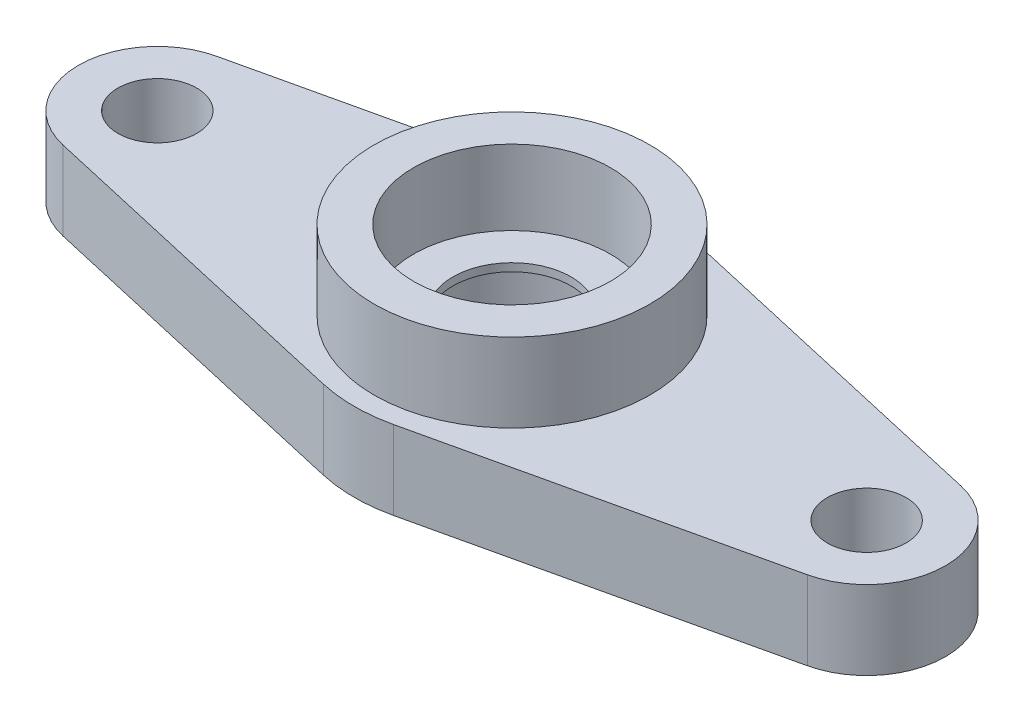
ISO-10303-21;
HEADER;
FILE_DESCRIPTION(('STEP AP214'),'2;1');
FILE_NAME('part.step','',(''),(''),'','','');
FILE_SCHEMA(('AUTOMOTIVE_DESIGN { 1 0 10303 214 1 1 1 1 }'));
ENDSEC;
DATA;
#1=APPLICATION_CONTEXT('core data for automotive mechanical design processes');
#2=APPLICATION_PROTOCOL_DEFINITION('international standard','automotive_design',2000,#1);
#3=PRODUCT_CONTEXT('',#1,'mechanical');
#4=PRODUCT('Part','Part','',(#3));
#5=PRODUCT_RELATED_PRODUCT_CATEGORY('part','',(#4));
#6=PRODUCT_DEFINITION_FORMATION('','',#4);
#7=PRODUCT_DEFINITION_CONTEXT('part definition',#1,'design');
#8=PRODUCT_DEFINITION('design','',#6,#7);
#9=PRODUCT_DEFINITION_SHAPE('','',#8);
#10=(LENGTH_UNIT() NAMED_UNIT(*) SI_UNIT(.MILLI.,.METRE.));
#11=(NAMED_UNIT(*) PLANE_ANGLE_UNIT() SI_UNIT($,.RADIAN.));
#12=(NAMED_UNIT(*) SI_UNIT($,.STERADIAN.) SOLID_ANGLE_UNIT());
#13=UNCERTAINTY_MEASURE_WITH_UNIT(LENGTH_MEASURE(1.E-05),#10,'distance_accuracy_value','');
#14=(GEOMETRIC_REPRESENTATION_CONTEXT(3) GLOBAL_UNCERTAINTY_ASSIGNED_CONTEXT((#13)) GLOBAL_UNIT_ASSIGNED_CONTEXT((#10,
#11,#12)) REPRESENTATION_CONTEXT('',''));
#15=CARTESIAN_POINT('',(0.,0.,0.));
#16=DIRECTION('',(0.,0.,1.));
#17=DIRECTION('',(1.,0.,0.));
#18=AXIS2_PLACEMENT_3D('',#15,#16,#17);
#19=CARTESIAN_POINT('',(0.,2.,0.));
#20=DIRECTION('',(0.,-1.,0.));
#21=DIRECTION('',(0.,0.,-1.));
#22=AXIS2_PLACEMENT_3D('',#19,#20,#21);
#23=CYLINDRICAL_SURFACE('',#22,2.5);
#24=CARTESIAN_POINT('',(0.,0.,0.));
#25=DIRECTION('',(0.,1.,0.));
#26=DIRECTION('',(0.,0.,1.));
#27=AXIS2_PLACEMENT_3D('',#24,#25,#26);
#28=CIRCLE('',#27,2.5);
#29=CARTESIAN_POINT('',(0.,0.,2.5));
#30=VERTEX_POINT('',#29);
#31=EDGE_CURVE('E137',#30,#30,#28,.T.);
#32=ORIENTED_EDGE('',*,*,#31,.F.);
#33=EDGE_LOOP('',(#32));
#34=FACE_BOUND('',#33,.T.);
#35=CARTESIAN_POINT('',(0.,1.9,0.));
#36=DIRECTION('',(0.,1.,0.));
#37=DIRECTION('',(0.,0.,1.));
#38=AXIS2_PLACEMENT_3D('',#35,#36,#37);
#39=CIRCLE('',#38,2.5);
#40=CARTESIAN_POINT('',(0.,1.9,2.5));
#41=VERTEX_POINT('',#40);
#42=EDGE_CURVE('E209',#41,#41,#39,.T.);
#43=ORIENTED_EDGE('',*,*,#42,.T.);
#44=EDGE_LOOP('',(#43));
#45=FACE_BOUND('',#44,.T.);
#46=ADVANCED_FACE('F34',(#34,#45),#23,.F.);
#47=CARTESIAN_POINT('',(-9.,2.,0.));
#48=DIRECTION('',(0.,1.,0.));
#49=DIRECTION('',(0.,0.,1.));
#50=AXIS2_PLACEMENT_3D('',#47,#48,#49);
#51=PLANE('',#50);
#52=CARTESIAN_POINT('',(9.,2.,0.));
#53=DIRECTION('',(0.,1.,0.));
#54=DIRECTION('',(0.,0.,1.));
#55=AXIS2_PLACEMENT_3D('',#52,#53,#54);
#56=CIRCLE('',#55,1.);
#57=CARTESIAN_POINT('',(9.,2.,0.999999999999996));
#58=VERTEX_POINT('',#57);
#59=EDGE_CURVE('E192',#58,#58,#56,.T.);
#60=ORIENTED_EDGE('',*,*,#59,.F.);
#61=EDGE_LOOP('',(#60));
#62=FACE_BOUND('',#61,.T.);
#63=CARTESIAN_POINT('',(-9.,2.,0.));
#64=DIRECTION('',(0.,1.,0.));
#65=DIRECTION('',(0.,0.,1.));
#66=AXIS2_PLACEMENT_3D('',#63,#64,#65);
#67=CIRCLE('',#66,2.);
#68=CARTESIAN_POINT('',(-9.44444444444444,2.,-1.94999208608714));
#69=VERTEX_POINT('',#68);
#70=CARTESIAN_POINT('',(-9.44444444444444,2.,1.94999208608714));
#71=VERTEX_POINT('',#70);
#72=EDGE_CURVE('E148',#69,#71,#67,.T.);
#73=ORIENTED_EDGE('',*,*,#72,.T.);
#74=DIRECTION('',(0.974996043043569,0.,0.222222222222222));
#75=VECTOR('',#74,1.);
#76=CARTESIAN_POINT('',(-9.44444444444444,2.,1.94999208608714));
#77=LINE('',#76,#75);
#78=CARTESIAN_POINT('',(-0.88888888888889,2.,3.89998417217428));
#79=VERTEX_POINT('',#78);
#80=EDGE_CURVE('E95',#71,#79,#77,.T.);
#81=ORIENTED_EDGE('',*,*,#80,.T.);
#82=CARTESIAN_POINT('',(0.,2.,0.));
#83=DIRECTION('',(0.,1.,0.));
#84=DIRECTION('',(0.,0.,1.));
#85=AXIS2_PLACEMENT_3D('',#82,#83,#84);
#86=CIRCLE('',#85,4.);
#87=CARTESIAN_POINT('',(0.88888888888889,2.,3.89998417217427));
#88=VERTEX_POINT('',#87);
#89=EDGE_CURVE('E180',#79,#88,#86,.T.);
#90=ORIENTED_EDGE('',*,*,#89,.T.);
#91=DIRECTION('',(0.974996043043569,0.,-0.222222222222223));
#92=VECTOR('',#91,1.);
#93=CARTESIAN_POINT('',(0.88888888888889,2.,3.89998417217427));
#94=LINE('',#93,#92);
#95=CARTESIAN_POINT('',(9.44444444444444,2.,1.94999208608713));
#96=VERTEX_POINT('',#95);
#97=EDGE_CURVE('E179',#88,#96,#94,.T.);
#98=ORIENTED_EDGE('',*,*,#97,.T.);
#99=CARTESIAN_POINT('',(9.,2.,0.));
#100=DIRECTION('',(0.,1.,0.));
#101=DIRECTION('',(0.,0.,1.));
#102=AXIS2_PLACEMENT_3D('',#99,#100,#101);
#103=CIRCLE('',#102,2.);
#104=CARTESIAN_POINT('',(9.44444444444444,2.,-1.94999208608714));
#105=VERTEX_POINT('',#104);
#106=EDGE_CURVE('E115',#96,#105,#103,.T.);
#107=ORIENTED_EDGE('',*,*,#106,.T.);
#108=DIRECTION('',(-0.974996043043569,0.,-0.222222222222222));
#109=VECTOR('',#108,1.);
#110=CARTESIAN_POINT('',(0.888888888888887,2.,-3.89998417217428));
#111=LINE('',#110,#109);
#112=CARTESIAN_POINT('',(0.888888888888888,2.,-3.89998417217428));
#113=VERTEX_POINT('',#112);
#114=EDGE_CURVE('E108',#105,#113,#111,.T.);
#115=ORIENTED_EDGE('',*,*,#114,.T.);
#116=CARTESIAN_POINT('',(0.,2.,0.));
#117=DIRECTION('',(0.,1.,0.));
#118=DIRECTION('',(0.,0.,1.));
#119=AXIS2_PLACEMENT_3D('',#116,#117,#118);
#120=CIRCLE('',#119,4.);
#121=CARTESIAN_POINT('',(-0.888888888888889,2.,-3.89998417217428));
#122=VERTEX_POINT('',#121);
#123=EDGE_CURVE('E113',#113,#122,#120,.T.);
#124=ORIENTED_EDGE('',*,*,#123,.T.);
#125=DIRECTION('',(-0.974996043043569,0.,0.222222222222222));
#126=VECTOR('',#125,1.);
#127=CARTESIAN_POINT('',(-9.44444444444444,2.,-1.94999208608714));
#128=LINE('',#127,#126);
#129=EDGE_CURVE('E51',#122,#69,#128,.T.);
#130=ORIENTED_EDGE('',*,*,#129,.T.);
#131=EDGE_LOOP('',(#73,#81,#90,#98,#107,#115,#124,#130));
#132=FACE_BOUND('',#131,.T.);
#133=CARTESIAN_POINT('',(-9.,2.,0.));
#134=DIRECTION('',(0.,1.,0.));
#135=DIRECTION('',(0.,0.,1.));
#136=AXIS2_PLACEMENT_3D('',#133,#134,#135);
#137=CIRCLE('',#136,1.);
#138=CARTESIAN_POINT('',(-9.,2.,1.));
#139=VERTEX_POINT('',#138);
#140=EDGE_CURVE('E188',#139,#139,#137,.T.);
#141=ORIENTED_EDGE('',*,*,#140,.F.);
#142=EDGE_LOOP('',(#141));
#143=FACE_BOUND('',#142,.T.);
#144=CARTESIAN_POINT('',(0.,2.,0.));
#145=DIRECTION('',(0.,1.,0.));
#146=DIRECTION('',(0.,0.,1.));
#147=AXIS2_PLACEMENT_3D('',#144,#145,#146);
#148=CIRCLE('',#147,3.5);
#149=CARTESIAN_POINT('',(0.,2.,3.5));
#150=VERTEX_POINT('',#149);
#151=EDGE_CURVE('E201',#150,#150,#148,.T.);
#152=ORIENTED_EDGE('',*,*,#151,.F.);
#153=EDGE_LOOP('',(#152));
#154=FACE_BOUND('',#153,.T.);
#155=ADVANCED_FACE('F110',(#62,#132,#143,#154),#51,.T.);
#156=CARTESIAN_POINT('',(-9.,0.,0.));
#157=DIRECTION('',(0.,1.,0.));
#158=DIRECTION('',(0.,0.,1.));
#159=AXIS2_PLACEMENT_3D('',#156,#157,#158);
#160=PLANE('',#159);
#161=CARTESIAN_POINT('',(-9.,0.,0.));
#162=DIRECTION('',(0.,1.,0.));
#163=DIRECTION('',(0.,0.,1.));
#164=AXIS2_PLACEMENT_3D('',#161,#162,#163);
#165=CIRCLE('',#164,1.);
#166=CARTESIAN_POINT('',(-9.,0.,1.));
#167=VERTEX_POINT('',#166);
#168=EDGE_CURVE('E189',#167,#167,#165,.T.);
#169=ORIENTED_EDGE('',*,*,#168,.T.);
#170=EDGE_LOOP('',(#169));
#171=FACE_BOUND('',#170,.T.);
#172=CARTESIAN_POINT('',(-9.,0.,0.));
#173=DIRECTION('',(0.,1.,0.));
#174=DIRECTION('',(0.,0.,1.));
#175=AXIS2_PLACEMENT_3D('',#172,#173,#174);
#176=CIRCLE('',#175,2.);
#177=CARTESIAN_POINT('',(-9.44444444444444,0.,-1.94999208608714));
#178=VERTEX_POINT('',#177);
#179=CARTESIAN_POINT('',(-9.44444444444444,0.,1.94999208608714));
#180=VERTEX_POINT('',#179);
#181=EDGE_CURVE('E133',#178,#180,#176,.T.);
#182=ORIENTED_EDGE('',*,*,#181,.F.);
#183=DIRECTION('',(-0.974996043043569,0.,0.222222222222222));
#184=VECTOR('',#183,1.);
#185=CARTESIAN_POINT('',(-9.44444444444444,0.,-1.94999208608714));
#186=LINE('',#185,#184);
#187=CARTESIAN_POINT('',(-0.888888888888889,0.,-3.89998417217428));
#188=VERTEX_POINT('',#187);
#189=EDGE_CURVE('E86',#188,#178,#186,.T.);
#190=ORIENTED_EDGE('',*,*,#189,.F.);
#191=CARTESIAN_POINT('',(0.,0.,0.));
#192=DIRECTION('',(0.,1.,0.));
#193=DIRECTION('',(0.,0.,1.));
#194=AXIS2_PLACEMENT_3D('',#191,#192,#193);
#195=CIRCLE('',#194,4.);
#196=CARTESIAN_POINT('',(0.888888888888888,0.,-3.89998417217428));
#197=VERTEX_POINT('',#196);
#198=EDGE_CURVE('E80',#197,#188,#195,.T.);
#199=ORIENTED_EDGE('',*,*,#198,.F.);
#200=DIRECTION('',(-0.974996043043569,0.,-0.222222222222222));
#201=VECTOR('',#200,1.);
#202=CARTESIAN_POINT('',(0.888888888888887,0.,-3.89998417217428));
#203=LINE('',#202,#201);
#204=CARTESIAN_POINT('',(9.44444444444444,0.,-1.94999208608714));
#205=VERTEX_POINT('',#204);
#206=EDGE_CURVE('E123',#205,#197,#203,.T.);
#207=ORIENTED_EDGE('',*,*,#206,.F.);
#208=CARTESIAN_POINT('',(9.,0.,0.));
#209=DIRECTION('',(0.,1.,0.));
#210=DIRECTION('',(0.,0.,1.));
#211=AXIS2_PLACEMENT_3D('',#208,#209,#210);
#212=CIRCLE('',#211,2.);
#213=CARTESIAN_POINT('',(9.44444444444444,0.,1.94999208608713));
#214=VERTEX_POINT('',#213);
#215=EDGE_CURVE('E143',#214,#205,#212,.T.);
#216=ORIENTED_EDGE('',*,*,#215,.F.);
#217=DIRECTION('',(0.974996043043569,0.,-0.222222222222223));
#218=VECTOR('',#217,1.);
#219=CARTESIAN_POINT('',(0.88888888888889,0.,3.89998417217427));
#220=LINE('',#219,#218);
#221=CARTESIAN_POINT('',(0.88888888888889,0.,3.89998417217427));
#222=VERTEX_POINT('',#221);
#223=EDGE_CURVE('E141',#222,#214,#220,.T.);
#224=ORIENTED_EDGE('',*,*,#223,.F.);
#225=CARTESIAN_POINT('',(0.,0.,0.));
#226=DIRECTION('',(0.,1.,0.));
#227=DIRECTION('',(0.,0.,1.));
#228=AXIS2_PLACEMENT_3D('',#225,#226,#227);
#229=CIRCLE('',#228,4.);
#230=CARTESIAN_POINT('',(-0.88888888888889,0.,3.89998417217428));
#231=VERTEX_POINT('',#230);
#232=EDGE_CURVE('E139',#231,#222,#229,.T.);
#233=ORIENTED_EDGE('',*,*,#232,.F.);
#234=DIRECTION('',(0.974996043043569,0.,0.222222222222222));
#235=VECTOR('',#234,1.);
#236=CARTESIAN_POINT('',(-9.44444444444444,0.,1.94999208608714));
#237=LINE('',#236,#235);
#238=EDGE_CURVE('E136',#180,#231,#237,.T.);
#239=ORIENTED_EDGE('',*,*,#238,.F.);
#240=EDGE_LOOP('',(#182,#190,#199,#207,#216,#224,#233,#239));
#241=FACE_BOUND('',#240,.T.);
#242=ORIENTED_EDGE('',*,*,#31,.T.);
#243=EDGE_LOOP('',(#242));
#244=FACE_BOUND('',#243,.T.);
#245=CARTESIAN_POINT('',(9.,0.,0.));
#246=DIRECTION('',(0.,1.,0.));
#247=DIRECTION('',(0.,0.,1.));
#248=AXIS2_PLACEMENT_3D('',#245,#246,#247);
#249=CIRCLE('',#248,1.);
#250=CARTESIAN_POINT('',(9.,0.,0.999999999999996));
#251=VERTEX_POINT('',#250);
#252=EDGE_CURVE('E195',#251,#251,#249,.T.);
#253=ORIENTED_EDGE('',*,*,#252,.T.);
#254=EDGE_LOOP('',(#253));
#255=FACE_BOUND('',#254,.T.);
#256=ADVANCED_FACE('F166',(#171,#241,#244,#255),#160,.F.);
#257=CARTESIAN_POINT('',(-9.,2.,0.));
#258=DIRECTION('',(0.,-1.,0.));
#259=DIRECTION('',(0.,0.,-1.));
#260=AXIS2_PLACEMENT_3D('',#257,#258,#259);
#261=CYLINDRICAL_SURFACE('',#260,2.);
#262=ORIENTED_EDGE('',*,*,#181,.T.);
#263=DIRECTION('',(0.,-1.,0.));
#264=VECTOR('',#263,1.);
#265=CARTESIAN_POINT('',(-9.44444444444444,2.,1.94999208608714));
#266=LINE('',#265,#264);
#267=EDGE_CURVE('E43',#71,#180,#266,.T.);
#268=ORIENTED_EDGE('',*,*,#267,.F.);
#269=ORIENTED_EDGE('',*,*,#72,.F.);
#270=DIRECTION('',(0.,-1.,0.));
#271=VECTOR('',#270,1.);
#272=CARTESIAN_POINT('',(-9.44444444444444,2.,-1.94999208608714));
#273=LINE('',#272,#271);
#274=EDGE_CURVE('E129',#69,#178,#273,.T.);
#275=ORIENTED_EDGE('',*,*,#274,.T.);
#276=EDGE_LOOP('',(#262,#268,#269,#275));
#277=FACE_BOUND('',#276,.T.);
#278=ADVANCED_FACE('F36',(#277),#261,.T.);
#279=CARTESIAN_POINT('',(-9.44444444444444,2.,1.94999208608714));
#280=DIRECTION('',(0.222222222222222,0.,-0.974996043043569));
#281=DIRECTION('',(-0.974996043043569,0.,-0.222222222222222));
#282=AXIS2_PLACEMENT_3D('',#279,#280,#281);
#283=PLANE('',#282);
#284=ORIENTED_EDGE('',*,*,#238,.T.);
#285=DIRECTION('',(0.,-1.,0.));
#286=VECTOR('',#285,1.);
#287=CARTESIAN_POINT('',(-0.88888888888889,2.,3.89998417217428));
#288=LINE('',#287,#286);
#289=EDGE_CURVE('E158',#79,#231,#288,.T.);
#290=ORIENTED_EDGE('',*,*,#289,.F.);
#291=ORIENTED_EDGE('',*,*,#80,.F.);
#292=ORIENTED_EDGE('',*,*,#267,.T.);
#293=EDGE_LOOP('',(#284,#290,#291,#292));
#294=FACE_BOUND('',#293,.T.);
#295=ADVANCED_FACE('F161',(#294),#283,.F.);
#296=CARTESIAN_POINT('',(0.,2.,0.));
#297=DIRECTION('',(0.,-1.,0.));
#298=DIRECTION('',(0.,0.,-1.));
#299=AXIS2_PLACEMENT_3D('',#296,#297,#298);
#300=CYLINDRICAL_SURFACE('',#299,4.);
#301=ORIENTED_EDGE('',*,*,#232,.T.);
#302=DIRECTION('',(0.,-1.,0.));
#303=VECTOR('',#302,1.);
#304=CARTESIAN_POINT('',(0.88888888888889,2.,3.89998417217427));
#305=LINE('',#304,#303);
#306=EDGE_CURVE('E155',#88,#222,#305,.T.);
#307=ORIENTED_EDGE('',*,*,#306,.F.);
#308=ORIENTED_EDGE('',*,*,#89,.F.);
#309=ORIENTED_EDGE('',*,*,#289,.T.);
#310=EDGE_LOOP('',(#301,#307,#308,#309));
#311=FACE_BOUND('',#310,.T.);
#312=ADVANCED_FACE('F173',(#311),#300,.T.);
#313=CARTESIAN_POINT('',(0.88888888888889,2.,3.89998417217427));
#314=DIRECTION('',(-0.222222222222222,0.,-0.974996043043569));
#315=DIRECTION('',(-0.974996043043569,0.,0.222222222222223));
#316=AXIS2_PLACEMENT_3D('',#313,#314,#315);
#317=PLANE('',#316);
#318=ORIENTED_EDGE('',*,*,#223,.T.);
#319=DIRECTION('',(0.,-1.,0.));
#320=VECTOR('',#319,1.);
#321=CARTESIAN_POINT('',(9.44444444444444,2.,1.94999208608713));
#322=LINE('',#321,#320);
#323=EDGE_CURVE('E152',#96,#214,#322,.T.);
#324=ORIENTED_EDGE('',*,*,#323,.F.);
#325=ORIENTED_EDGE('',*,*,#97,.F.);
#326=ORIENTED_EDGE('',*,*,#306,.T.);
#327=EDGE_LOOP('',(#318,#324,#325,#326));
#328=FACE_BOUND('',#327,.T.);
#329=ADVANCED_FACE('F177',(#328),#317,.F.);
#330=CARTESIAN_POINT('',(9.,2.,0.));
#331=DIRECTION('',(0.,-1.,0.));
#332=DIRECTION('',(0.,0.,-1.));
#333=AXIS2_PLACEMENT_3D('',#330,#331,#332);
#334=CYLINDRICAL_SURFACE('',#333,2.);
#335=ORIENTED_EDGE('',*,*,#215,.T.);
#336=DIRECTION('',(0.,-1.,0.));
#337=VECTOR('',#336,1.);
#338=CARTESIAN_POINT('',(9.44444444444444,2.,-1.94999208608714));
#339=LINE('',#338,#337);
#340=EDGE_CURVE('E124',#105,#205,#339,.T.);
#341=ORIENTED_EDGE('',*,*,#340,.F.);
#342=ORIENTED_EDGE('',*,*,#106,.F.);
#343=ORIENTED_EDGE('',*,*,#323,.T.);
#344=EDGE_LOOP('',(#335,#341,#342,#343));
#345=FACE_BOUND('',#344,.T.);
#346=ADVANCED_FACE('F355',(#345),#334,.T.);
#347=CARTESIAN_POINT('',(0.888888888888887,2.,-3.89998417217428));
#348=DIRECTION('',(-0.222222222222222,0.,0.974996043043569));
#349=DIRECTION('',(0.974996043043569,0.,0.222222222222222));
#350=AXIS2_PLACEMENT_3D('',#347,#348,#349);
#351=PLANE('',#350);
#352=ORIENTED_EDGE('',*,*,#206,.T.);
#353=DIRECTION('',(0.,-1.,0.));
#354=VECTOR('',#353,1.);
#355=CARTESIAN_POINT('',(0.888888888888888,2.,-3.89998417217428));
#356=LINE('',#355,#354);
#357=EDGE_CURVE('E120',#113,#197,#356,.T.);
#358=ORIENTED_EDGE('',*,*,#357,.F.);
#359=ORIENTED_EDGE('',*,*,#114,.F.);
#360=ORIENTED_EDGE('',*,*,#340,.T.);
#361=EDGE_LOOP('',(#352,#358,#359,#360));
#362=FACE_BOUND('',#361,.T.);
#363=ADVANCED_FACE('F121',(#362),#351,.F.);
#364=CARTESIAN_POINT('',(0.,2.,0.));
#365=DIRECTION('',(0.,-1.,0.));
#366=DIRECTION('',(0.,0.,-1.));
#367=AXIS2_PLACEMENT_3D('',#364,#365,#366);
#368=CYLINDRICAL_SURFACE('',#367,4.);
#369=ORIENTED_EDGE('',*,*,#198,.T.);
#370=DIRECTION('',(0.,-1.,0.));
#371=VECTOR('',#370,1.);
#372=CARTESIAN_POINT('',(-0.888888888888889,2.,-3.89998417217428));
#373=LINE('',#372,#371);
#374=EDGE_CURVE('E125',#122,#188,#373,.T.);
#375=ORIENTED_EDGE('',*,*,#374,.F.);
#376=ORIENTED_EDGE('',*,*,#123,.F.);
#377=ORIENTED_EDGE('',*,*,#357,.T.);
#378=EDGE_LOOP('',(#369,#375,#376,#377));
#379=FACE_BOUND('',#378,.T.);
#380=ADVANCED_FACE('F127',(#379),#368,.T.);
#381=CARTESIAN_POINT('',(-9.44444444444444,2.,-1.94999208608714));
#382=DIRECTION('',(0.222222222222222,0.,0.974996043043569));
#383=DIRECTION('',(0.974996043043569,0.,-0.222222222222222));
#384=AXIS2_PLACEMENT_3D('',#381,#382,#383);
#385=PLANE('',#384);
#386=ORIENTED_EDGE('',*,*,#189,.T.);
#387=ORIENTED_EDGE('',*,*,#274,.F.);
#388=ORIENTED_EDGE('',*,*,#129,.F.);
#389=ORIENTED_EDGE('',*,*,#374,.T.);
#390=EDGE_LOOP('',(#386,#387,#388,#389));
#391=FACE_BOUND('',#390,.T.);
#392=ADVANCED_FACE('F245',(#391),#385,.F.);
#393=CARTESIAN_POINT('',(0.,2.1,0.));
#394=DIRECTION('',(0.,1.,0.));
#395=DIRECTION('',(0.,0.,1.));
#396=AXIS2_PLACEMENT_3D('',#393,#394,#395);
#397=CIRCLE('',#396,2.5);
#398=CARTESIAN_POINT('',(0.,2.1,2.5));
#399=VERTEX_POINT('',#398);
#400=EDGE_CURVE('E11',#399,#399,#397,.T.);
#401=ORIENTED_EDGE('',*,*,#400,.F.);
#402=EDGE_LOOP('',(#401));
#403=FACE_BOUND('',#402,.T.);
#404=CARTESIAN_POINT('',(0.,4.,0.));
#405=DIRECTION('',(0.,1.,0.));
#406=DIRECTION('',(0.,0.,1.));
#407=AXIS2_PLACEMENT_3D('',#404,#405,#406);
#408=CIRCLE('',#407,2.5);
#409=CARTESIAN_POINT('',(0.,4.,2.5));
#410=VERTEX_POINT('',#409);
#411=EDGE_CURVE('E204',#410,#410,#408,.T.);
#412=ORIENTED_EDGE('',*,*,#411,.T.);
#413=EDGE_LOOP('',(#412));
#414=FACE_BOUND('',#413,.T.);
#415=ADVANCED_FACE('F234',(#403,#414),#23,.F.);
#416=CARTESIAN_POINT('',(-9.,2.,0.));
#417=DIRECTION('',(0.,-1.,0.));
#418=DIRECTION('',(0.,0.,-1.));
#419=AXIS2_PLACEMENT_3D('',#416,#417,#418);
#420=CYLINDRICAL_SURFACE('',#419,1.);
#421=ORIENTED_EDGE('',*,*,#140,.T.);
#422=EDGE_LOOP('',(#421));
#423=FACE_BOUND('',#422,.T.);
#424=ORIENTED_EDGE('',*,*,#168,.F.);
#425=EDGE_LOOP('',(#424));
#426=FACE_BOUND('',#425,.T.);
#427=ADVANCED_FACE('F244',(#423,#426),#420,.F.);
#428=CARTESIAN_POINT('',(9.,2.,0.));
#429=DIRECTION('',(0.,-1.,0.));
#430=DIRECTION('',(0.,0.,-1.));
#431=AXIS2_PLACEMENT_3D('',#428,#429,#430);
#432=CYLINDRICAL_SURFACE('',#431,1.);
#433=ORIENTED_EDGE('',*,*,#59,.T.);
#434=EDGE_LOOP('',(#433));
#435=FACE_BOUND('',#434,.T.);
#436=ORIENTED_EDGE('',*,*,#252,.F.);
#437=EDGE_LOOP('',(#436));
#438=FACE_BOUND('',#437,.T.);
#439=ADVANCED_FACE('F251',(#435,#438),#432,.F.);
#440=CARTESIAN_POINT('',(0.,4.,0.));
#441=DIRECTION('',(0.,1.,0.));
#442=DIRECTION('',(0.,0.,1.));
#443=AXIS2_PLACEMENT_3D('',#440,#441,#442);
#444=PLANE('',#443);
#445=CARTESIAN_POINT('',(0.,4.,0.));
#446=DIRECTION('',(0.,1.,0.));
#447=DIRECTION('',(0.,0.,1.));
#448=AXIS2_PLACEMENT_3D('',#445,#446,#447);
#449=CIRCLE('',#448,3.5);
#450=CARTESIAN_POINT('',(0.,4.,3.5));
#451=VERTEX_POINT('',#450);
#452=EDGE_CURVE('E198',#451,#451,#449,.T.);
#453=ORIENTED_EDGE('',*,*,#452,.T.);
#454=EDGE_LOOP('',(#453));
#455=FACE_BOUND('',#454,.T.);
#456=ORIENTED_EDGE('',*,*,#411,.F.);
#457=EDGE_LOOP('',(#456));
#458=FACE_BOUND('',#457,.T.);
#459=ADVANCED_FACE('F258',(#455,#458),#444,.T.);
#460=CARTESIAN_POINT('',(0.,4.,0.));
#461=DIRECTION('',(0.,-1.,0.));
#462=DIRECTION('',(0.,0.,-1.));
#463=AXIS2_PLACEMENT_3D('',#460,#461,#462);
#464=CYLINDRICAL_SURFACE('',#463,3.5);
#465=ORIENTED_EDGE('',*,*,#452,.F.);
#466=EDGE_LOOP('',(#465));
#467=FACE_BOUND('',#466,.T.);
#468=ORIENTED_EDGE('',*,*,#151,.T.);
#469=EDGE_LOOP('',(#468));
#470=FACE_BOUND('',#469,.T.);
#471=ADVANCED_FACE('F260',(#467,#470),#464,.T.);
#472=CARTESIAN_POINT('',(0.,1.9,0.));
#473=DIRECTION('',(0.,1.,0.));
#474=DIRECTION('',(0.,0.,1.));
#475=AXIS2_PLACEMENT_3D('',#472,#473,#474);
#476=PLANE('',#475);
#477=CARTESIAN_POINT('',(0.,1.9,0.));
#478=DIRECTION('',(0.,1.,0.));
#479=DIRECTION('',(0.,0.,1.));
#480=AXIS2_PLACEMENT_3D('',#477,#478,#479);
#481=CIRCLE('',#480,1.5);
#482=CARTESIAN_POINT('',(0.,1.9,1.5));
#483=VERTEX_POINT('',#482);
#484=EDGE_CURVE('E212',#483,#483,#481,.T.);
#485=ORIENTED_EDGE('',*,*,#484,.T.);
#486=EDGE_LOOP('',(#485));
#487=FACE_BOUND('',#486,.T.);
#488=ORIENTED_EDGE('',*,*,#42,.F.);
#489=EDGE_LOOP('',(#488));
#490=FACE_BOUND('',#489,.T.);
#491=ADVANCED_FACE('F228',(#487,#490),#476,.F.);
#492=CARTESIAN_POINT('',(0.,1.9,0.));
#493=DIRECTION('',(0.,1.,0.));
#494=DIRECTION('',(0.,0.,1.));
#495=AXIS2_PLACEMENT_3D('',#492,#493,#494);
#496=CYLINDRICAL_SURFACE('',#495,1.5);
#497=ORIENTED_EDGE('',*,*,#484,.F.);
#498=EDGE_LOOP('',(#497));
#499=FACE_BOUND('',#498,.T.);
#500=CARTESIAN_POINT('',(0.,2.1,0.));
#501=DIRECTION('',(0.,1.,0.));
#502=DIRECTION('',(0.,0.,1.));
#503=AXIS2_PLACEMENT_3D('',#500,#501,#502);
#504=CIRCLE('',#503,1.5);
#505=CARTESIAN_POINT('',(0.,2.1,1.5));
#506=VERTEX_POINT('',#505);
#507=EDGE_CURVE('E215',#506,#506,#504,.T.);
#508=ORIENTED_EDGE('',*,*,#507,.T.);
#509=EDGE_LOOP('',(#508));
#510=FACE_BOUND('',#509,.T.);
#511=ADVANCED_FACE('F219',(#499,#510),#496,.F.);
#512=CARTESIAN_POINT('',(0.,2.1,0.));
#513=DIRECTION('',(0.,1.,0.));
#514=DIRECTION('',(0.,0.,1.));
#515=AXIS2_PLACEMENT_3D('',#512,#513,#514);
#516=PLANE('',#515);
#517=ORIENTED_EDGE('',*,*,#400,.T.);
#518=EDGE_LOOP('',(#517));
#519=FACE_BOUND('',#518,.T.);
#520=ORIENTED_EDGE('',*,*,#507,.F.);
#521=EDGE_LOOP('',(#520));
#522=FACE_BOUND('',#521,.T.);
#523=ADVANCED_FACE('F221',(#519,#522),#516,.T.);
#524=CLOSED_SHELL('',(#46,#155,#256,#278,#295,#312,#329,#346,#363,#380,#392,#415,#427,#439,#459,
#471,#491,#511,#523));
#525=MANIFOLD_SOLID_BREP('B2',#524);
#526=ADVANCED_BREP_SHAPE_REPRESENTATION('',(#18,#525),#14);
#527=SHAPE_DEFINITION_REPRESENTATION(#9,#526);
ENDSEC;
END-ISO-10303-21;
